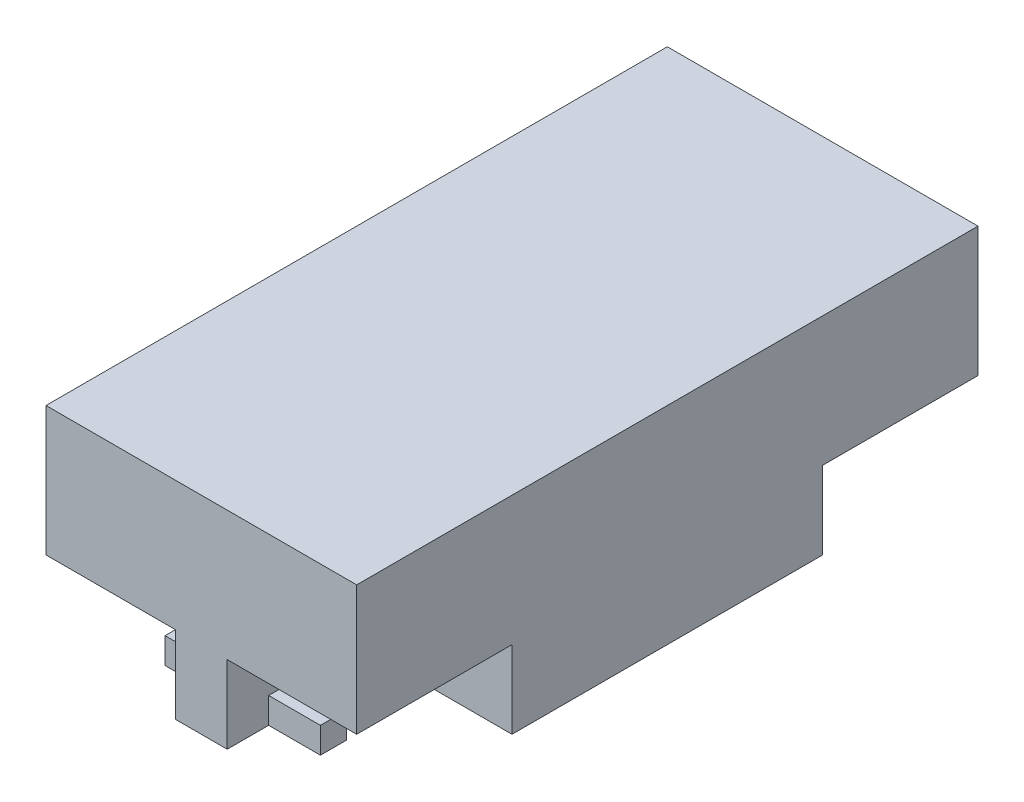
ISO-10303-21;
HEADER;
FILE_DESCRIPTION(('STEP AP214'),'2;1');
FILE_NAME('part.step','',(''),(''),'','','');
FILE_SCHEMA(('AUTOMOTIVE_DESIGN { 1 0 10303 214 1 1 1 1 }'));
ENDSEC;
DATA;
#1=APPLICATION_CONTEXT('core data for automotive mechanical design processes');
#2=APPLICATION_PROTOCOL_DEFINITION('international standard','automotive_design',2000,#1);
#3=PRODUCT_CONTEXT('',#1,'mechanical');
#4=PRODUCT('Part','Part','',(#3));
#5=PRODUCT_RELATED_PRODUCT_CATEGORY('part','',(#4));
#6=PRODUCT_DEFINITION_FORMATION('','',#4);
#7=PRODUCT_DEFINITION_CONTEXT('part definition',#1,'design');
#8=PRODUCT_DEFINITION('design','',#6,#7);
#9=PRODUCT_DEFINITION_SHAPE('','',#8);
#10=(LENGTH_UNIT() NAMED_UNIT(*) SI_UNIT(.MILLI.,.METRE.));
#11=(NAMED_UNIT(*) PLANE_ANGLE_UNIT() SI_UNIT($,.RADIAN.));
#12=(NAMED_UNIT(*) SI_UNIT($,.STERADIAN.) SOLID_ANGLE_UNIT());
#13=UNCERTAINTY_MEASURE_WITH_UNIT(LENGTH_MEASURE(1.E-05),#10,'distance_accuracy_value','');
#14=(GEOMETRIC_REPRESENTATION_CONTEXT(3) GLOBAL_UNCERTAINTY_ASSIGNED_CONTEXT((#13)) GLOBAL_UNIT_ASSIGNED_CONTEXT((#10,
#11,#12)) REPRESENTATION_CONTEXT('',''));
#15=CARTESIAN_POINT('',(0.,0.,0.));
#16=DIRECTION('',(0.,0.,1.));
#17=DIRECTION('',(1.,0.,0.));
#18=AXIS2_PLACEMENT_3D('',#15,#16,#17);
#19=CARTESIAN_POINT('',(-25.,0.,0.));
#20=DIRECTION('',(-1.,0.,0.));
#21=DIRECTION('',(0.,0.,-1.));
#22=AXIS2_PLACEMENT_3D('',#19,#20,#21);
#23=PLANE('',#22);
#24=DIRECTION('',(0.,0.,-1.));
#25=VECTOR('',#24,1.);
#26=CARTESIAN_POINT('',(-25.,-100.,-300.));
#27=LINE('',#26,#25);
#28=CARTESIAN_POINT('',(-25.,-100.,-260.));
#29=VERTEX_POINT('',#28);
#30=CARTESIAN_POINT('',(-25.,-100.,-300.));
#31=VERTEX_POINT('',#30);
#32=EDGE_CURVE('E401',#29,#31,#27,.T.);
#33=ORIENTED_EDGE('',*,*,#32,.F.);
#34=DIRECTION('',(0.,-1.,0.));
#35=VECTOR('',#34,1.);
#36=CARTESIAN_POINT('',(-25.,-75.,-260.));
#37=LINE('',#36,#35);
#38=CARTESIAN_POINT('',(-25.,-75.,-260.));
#39=VERTEX_POINT('',#38);
#40=EDGE_CURVE('E259',#39,#29,#37,.T.);
#41=ORIENTED_EDGE('',*,*,#40,.F.);
#42=DIRECTION('',(0.,0.,-1.));
#43=VECTOR('',#42,1.);
#44=CARTESIAN_POINT('',(-25.,-75.,-260.));
#45=LINE('',#44,#43);
#46=CARTESIAN_POINT('',(-25.,-75.,-235.));
#47=VERTEX_POINT('',#46);
#48=EDGE_CURVE('E290',#47,#39,#45,.T.);
#49=ORIENTED_EDGE('',*,*,#48,.F.);
#50=DIRECTION('',(0.,1.,0.));
#51=VECTOR('',#50,1.);
#52=CARTESIAN_POINT('',(-25.,-75.,-235.));
#53=LINE('',#52,#51);
#54=CARTESIAN_POINT('',(-25.,-100.,-235.));
#55=VERTEX_POINT('',#54);
#56=EDGE_CURVE('E299',#55,#47,#53,.T.);
#57=ORIENTED_EDGE('',*,*,#56,.F.);
#58=CARTESIAN_POINT('',(-25.,-100.,-150.));
#59=VERTEX_POINT('',#58);
#60=EDGE_CURVE('E403',#59,#55,#27,.T.);
#61=ORIENTED_EDGE('',*,*,#60,.F.);
#62=DIRECTION('',(0.,-1.,0.));
#63=VECTOR('',#62,1.);
#64=CARTESIAN_POINT('',(-25.,-100.,-150.));
#65=LINE('',#64,#63);
#66=CARTESIAN_POINT('',(-25.,-25.0000000000001,-150.));
#67=VERTEX_POINT('',#66);
#68=EDGE_CURVE('E406',#67,#59,#65,.T.);
#69=ORIENTED_EDGE('',*,*,#68,.F.);
#70=DIRECTION('',(0.,0.,1.));
#71=VECTOR('',#70,1.);
#72=CARTESIAN_POINT('',(-25.,-25.,-300.));
#73=LINE('',#72,#71);
#74=CARTESIAN_POINT('',(-25.,-25.,-300.));
#75=VERTEX_POINT('',#74);
#76=EDGE_CURVE('E408',#75,#67,#73,.T.);
#77=ORIENTED_EDGE('',*,*,#76,.F.);
#78=DIRECTION('',(0.,1.,0.));
#79=VECTOR('',#78,1.);
#80=CARTESIAN_POINT('',(-25.,-100.,-300.));
#81=LINE('',#80,#79);
#82=EDGE_CURVE('E398',#31,#75,#81,.T.);
#83=ORIENTED_EDGE('',*,*,#82,.F.);
#84=EDGE_LOOP('',(#33,#41,#49,#57,#61,#69,#77,#83));
#85=FACE_BOUND('',#84,.T.);
#86=ADVANCED_FACE('F39',(#85),#23,.T.);
#87=CARTESIAN_POINT('',(25.,0.,0.));
#88=DIRECTION('',(-1.,0.,0.));
#89=DIRECTION('',(0.,0.,1.));
#90=AXIS2_PLACEMENT_3D('',#87,#88,#89);
#91=PLANE('',#90);
#92=DIRECTION('',(0.,-1.,0.));
#93=VECTOR('',#92,1.);
#94=CARTESIAN_POINT('',(25.,-75.,260.));
#95=LINE('',#94,#93);
#96=CARTESIAN_POINT('',(25.,-75.,260.));
#97=VERTEX_POINT('',#96);
#98=CARTESIAN_POINT('',(25.,-100.,260.));
#99=VERTEX_POINT('',#98);
#100=EDGE_CURVE('E341',#97,#99,#95,.T.);
#101=ORIENTED_EDGE('',*,*,#100,.F.);
#102=DIRECTION('',(0.,0.,1.));
#103=VECTOR('',#102,1.);
#104=CARTESIAN_POINT('',(25.,-75.,260.));
#105=LINE('',#104,#103);
#106=CARTESIAN_POINT('',(25.,-75.,235.));
#107=VERTEX_POINT('',#106);
#108=EDGE_CURVE('E346',#107,#97,#105,.T.);
#109=ORIENTED_EDGE('',*,*,#108,.F.);
#110=DIRECTION('',(0.,1.,0.));
#111=VECTOR('',#110,1.);
#112=CARTESIAN_POINT('',(25.,-75.,235.));
#113=LINE('',#112,#111);
#114=CARTESIAN_POINT('',(25.,-100.,235.));
#115=VERTEX_POINT('',#114);
#116=EDGE_CURVE('E355',#115,#107,#113,.T.);
#117=ORIENTED_EDGE('',*,*,#116,.F.);
#118=DIRECTION('',(0.,0.,-1.));
#119=VECTOR('',#118,1.);
#120=CARTESIAN_POINT('',(25.,-100.,300.));
#121=LINE('',#120,#119);
#122=CARTESIAN_POINT('',(25.,-100.,150.));
#123=VERTEX_POINT('',#122);
#124=EDGE_CURVE('E423',#115,#123,#121,.T.);
#125=ORIENTED_EDGE('',*,*,#124,.T.);
#126=DIRECTION('',(0.,1.,0.));
#127=VECTOR('',#126,1.);
#128=CARTESIAN_POINT('',(25.,-100.,150.));
#129=LINE('',#128,#127);
#130=CARTESIAN_POINT('',(25.,-25.,150.));
#131=VERTEX_POINT('',#130);
#132=EDGE_CURVE('E427',#123,#131,#129,.T.);
#133=ORIENTED_EDGE('',*,*,#132,.T.);
#134=DIRECTION('',(0.,0.,1.));
#135=VECTOR('',#134,1.);
#136=CARTESIAN_POINT('',(25.,-25.,300.));
#137=LINE('',#136,#135);
#138=CARTESIAN_POINT('',(25.,-25.,300.));
#139=VERTEX_POINT('',#138);
#140=EDGE_CURVE('E430',#131,#139,#137,.T.);
#141=ORIENTED_EDGE('',*,*,#140,.T.);
#142=DIRECTION('',(0.,-1.,0.));
#143=VECTOR('',#142,1.);
#144=CARTESIAN_POINT('',(25.,-100.,300.));
#145=LINE('',#144,#143);
#146=CARTESIAN_POINT('',(25.,-100.,300.));
#147=VERTEX_POINT('',#146);
#148=EDGE_CURVE('E420',#139,#147,#145,.T.);
#149=ORIENTED_EDGE('',*,*,#148,.T.);
#150=EDGE_CURVE('E425',#147,#99,#121,.T.);
#151=ORIENTED_EDGE('',*,*,#150,.T.);
#152=EDGE_LOOP('',(#101,#109,#117,#125,#133,#141,#149,#151));
#153=FACE_BOUND('',#152,.T.);
#154=ADVANCED_FACE('F513',(#153),#91,.F.);
#155=CARTESIAN_POINT('',(-150.,100.,-300.));
#156=DIRECTION('',(0.,0.,-1.));
#157=DIRECTION('',(0.,1.,0.));
#158=AXIS2_PLACEMENT_3D('',#155,#156,#157);
#159=PLANE('',#158);
#160=ORIENTED_EDGE('',*,*,#82,.T.);
#161=DIRECTION('',(-1.,0.,0.));
#162=VECTOR('',#161,1.);
#163=CARTESIAN_POINT('',(-25.,-25.,-300.));
#164=LINE('',#163,#162);
#165=CARTESIAN_POINT('',(-150.,-25.,-300.));
#166=VERTEX_POINT('',#165);
#167=EDGE_CURVE('E388',#75,#166,#164,.T.);
#168=ORIENTED_EDGE('',*,*,#167,.T.);
#169=DIRECTION('',(0.,1.,0.));
#170=VECTOR('',#169,1.);
#171=CARTESIAN_POINT('',(-150.,100.,-300.));
#172=LINE('',#171,#170);
#173=CARTESIAN_POINT('',(-150.,100.,-300.));
#174=VERTEX_POINT('',#173);
#175=EDGE_CURVE('E478',#166,#174,#172,.T.);
#176=ORIENTED_EDGE('',*,*,#175,.T.);
#177=DIRECTION('',(1.,0.,0.));
#178=VECTOR('',#177,1.);
#179=CARTESIAN_POINT('',(-150.,100.,-300.));
#180=LINE('',#179,#178);
#181=CARTESIAN_POINT('',(150.,100.,-300.));
#182=VERTEX_POINT('',#181);
#183=EDGE_CURVE('E43',#174,#182,#180,.T.);
#184=ORIENTED_EDGE('',*,*,#183,.T.);
#185=DIRECTION('',(0.,1.,0.));
#186=VECTOR('',#185,1.);
#187=CARTESIAN_POINT('',(150.,100.,-300.));
#188=LINE('',#187,#186);
#189=CARTESIAN_POINT('',(150.,-25.,-300.));
#190=VERTEX_POINT('',#189);
#191=EDGE_CURVE('E442',#190,#182,#188,.T.);
#192=ORIENTED_EDGE('',*,*,#191,.F.);
#193=DIRECTION('',(1.,0.,0.));
#194=VECTOR('',#193,1.);
#195=CARTESIAN_POINT('',(25.,-25.,-300.));
#196=LINE('',#195,#194);
#197=CARTESIAN_POINT('',(25.,-25.,-300.));
#198=VERTEX_POINT('',#197);
#199=EDGE_CURVE('E459',#198,#190,#196,.T.);
#200=ORIENTED_EDGE('',*,*,#199,.F.);
#201=DIRECTION('',(0.,1.,0.));
#202=VECTOR('',#201,1.);
#203=CARTESIAN_POINT('',(25.,-100.,-300.));
#204=LINE('',#203,#202);
#205=CARTESIAN_POINT('',(25.,-100.,-300.));
#206=VERTEX_POINT('',#205);
#207=EDGE_CURVE('E446',#206,#198,#204,.T.);
#208=ORIENTED_EDGE('',*,*,#207,.F.);
#209=DIRECTION('',(1.,0.,0.));
#210=VECTOR('',#209,1.);
#211=CARTESIAN_POINT('',(-150.,-100.,-300.));
#212=LINE('',#211,#210);
#213=EDGE_CURVE('E11',#31,#206,#212,.T.);
#214=ORIENTED_EDGE('',*,*,#213,.F.);
#215=EDGE_LOOP('',(#160,#168,#176,#184,#192,#200,#208,#214));
#216=FACE_BOUND('',#215,.T.);
#217=ADVANCED_FACE('F41',(#216),#159,.T.);
#218=CARTESIAN_POINT('',(-150.,-100.,300.));
#219=DIRECTION('',(0.,-1.,0.));
#220=DIRECTION('',(0.,0.,-1.));
#221=AXIS2_PLACEMENT_3D('',#218,#219,#220);
#222=PLANE('',#221);
#223=DIRECTION('',(0.,0.,-1.));
#224=VECTOR('',#223,1.);
#225=CARTESIAN_POINT('',(-25.,-100.,300.));
#226=LINE('',#225,#224);
#227=CARTESIAN_POINT('',(-25.,-100.,300.));
#228=VERTEX_POINT('',#227);
#229=CARTESIAN_POINT('',(-25.,-100.,260.));
#230=VERTEX_POINT('',#229);
#231=EDGE_CURVE('E381',#228,#230,#226,.T.);
#232=ORIENTED_EDGE('',*,*,#231,.T.);
#233=DIRECTION('',(1.,0.,0.));
#234=VECTOR('',#233,1.);
#235=CARTESIAN_POINT('',(-75.,-100.,260.));
#236=LINE('',#235,#234);
#237=CARTESIAN_POINT('',(-75.,-100.,260.));
#238=VERTEX_POINT('',#237);
#239=EDGE_CURVE('E325',#238,#230,#236,.T.);
#240=ORIENTED_EDGE('',*,*,#239,.F.);
#241=DIRECTION('',(0.,0.,-1.));
#242=VECTOR('',#241,1.);
#243=CARTESIAN_POINT('',(-75.,-100.,260.));
#244=LINE('',#243,#242);
#245=CARTESIAN_POINT('',(-75.,-100.,235.));
#246=VERTEX_POINT('',#245);
#247=EDGE_CURVE('E322',#238,#246,#244,.T.);
#248=ORIENTED_EDGE('',*,*,#247,.T.);
#249=DIRECTION('',(1.,0.,0.));
#250=VECTOR('',#249,1.);
#251=CARTESIAN_POINT('',(-75.,-100.,235.));
#252=LINE('',#251,#250);
#253=CARTESIAN_POINT('',(-25.,-100.,235.));
#254=VERTEX_POINT('',#253);
#255=EDGE_CURVE('E334',#246,#254,#252,.T.);
#256=ORIENTED_EDGE('',*,*,#255,.T.);
#257=CARTESIAN_POINT('',(-25.,-100.,150.));
#258=VERTEX_POINT('',#257);
#259=EDGE_CURVE('E380',#254,#258,#226,.T.);
#260=ORIENTED_EDGE('',*,*,#259,.T.);
#261=DIRECTION('',(-1.,0.,0.));
#262=VECTOR('',#261,1.);
#263=CARTESIAN_POINT('',(-25.,-100.,150.));
#264=LINE('',#263,#262);
#265=CARTESIAN_POINT('',(-150.,-100.,150.));
#266=VERTEX_POINT('',#265);
#267=EDGE_CURVE('E391',#258,#266,#264,.T.);
#268=ORIENTED_EDGE('',*,*,#267,.T.);
#269=DIRECTION('',(0.,0.,-1.));
#270=VECTOR('',#269,1.);
#271=CARTESIAN_POINT('',(-150.,-100.,300.));
#272=LINE('',#271,#270);
#273=CARTESIAN_POINT('',(-150.,-100.,-150.));
#274=VERTEX_POINT('',#273);
#275=EDGE_CURVE('E486',#266,#274,#272,.T.);
#276=ORIENTED_EDGE('',*,*,#275,.T.);
#277=DIRECTION('',(-1.,0.,0.));
#278=VECTOR('',#277,1.);
#279=CARTESIAN_POINT('',(-25.,-100.,-150.));
#280=LINE('',#279,#278);
#281=EDGE_CURVE('E410',#59,#274,#280,.T.);
#282=ORIENTED_EDGE('',*,*,#281,.F.);
#283=ORIENTED_EDGE('',*,*,#60,.T.);
#284=DIRECTION('',(1.,0.,0.));
#285=VECTOR('',#284,1.);
#286=CARTESIAN_POINT('',(-75.,-100.,-235.));
#287=LINE('',#286,#285);
#288=CARTESIAN_POINT('',(-75.,-100.,-235.));
#289=VERTEX_POINT('',#288);
#290=EDGE_CURVE('E307',#289,#55,#287,.T.);
#291=ORIENTED_EDGE('',*,*,#290,.F.);
#292=DIRECTION('',(0.,0.,1.));
#293=VECTOR('',#292,1.);
#294=CARTESIAN_POINT('',(-75.,-100.,-260.));
#295=LINE('',#294,#293);
#296=CARTESIAN_POINT('',(-75.,-100.,-260.));
#297=VERTEX_POINT('',#296);
#298=EDGE_CURVE('E289',#297,#289,#295,.T.);
#299=ORIENTED_EDGE('',*,*,#298,.F.);
#300=DIRECTION('',(1.,0.,0.));
#301=VECTOR('',#300,1.);
#302=CARTESIAN_POINT('',(-75.,-100.,-260.));
#303=LINE('',#302,#301);
#304=EDGE_CURVE('E309',#297,#29,#303,.T.);
#305=ORIENTED_EDGE('',*,*,#304,.T.);
#306=ORIENTED_EDGE('',*,*,#32,.T.);
#307=ORIENTED_EDGE('',*,*,#213,.T.);
#308=DIRECTION('',(0.,0.,-1.));
#309=VECTOR('',#308,1.);
#310=CARTESIAN_POINT('',(25.,-100.,-300.));
#311=LINE('',#310,#309);
#312=CARTESIAN_POINT('',(25.,-100.,-260.));
#313=VERTEX_POINT('',#312);
#314=EDGE_CURVE('E456',#313,#206,#311,.T.);
#315=ORIENTED_EDGE('',*,*,#314,.F.);
#316=DIRECTION('',(-1.,0.,0.));
#317=VECTOR('',#316,1.);
#318=CARTESIAN_POINT('',(75.,-100.,-260.));
#319=LINE('',#318,#317);
#320=CARTESIAN_POINT('',(75.,-100.,-260.));
#321=VERTEX_POINT('',#320);
#322=EDGE_CURVE('E277',#321,#313,#319,.T.);
#323=ORIENTED_EDGE('',*,*,#322,.F.);
#324=DIRECTION('',(0.,0.,1.));
#325=VECTOR('',#324,1.);
#326=CARTESIAN_POINT('',(75.,-100.,-260.));
#327=LINE('',#326,#325);
#328=CARTESIAN_POINT('',(75.,-100.,-235.));
#329=VERTEX_POINT('',#328);
#330=EDGE_CURVE('E269',#321,#329,#327,.T.);
#331=ORIENTED_EDGE('',*,*,#330,.T.);
#332=DIRECTION('',(-1.,0.,0.));
#333=VECTOR('',#332,1.);
#334=CARTESIAN_POINT('',(75.,-100.,-235.));
#335=LINE('',#334,#333);
#336=CARTESIAN_POINT('',(25.,-100.,-235.));
#337=VERTEX_POINT('',#336);
#338=EDGE_CURVE('E282',#329,#337,#335,.T.);
#339=ORIENTED_EDGE('',*,*,#338,.T.);
#340=CARTESIAN_POINT('',(25.,-100.,-150.));
#341=VERTEX_POINT('',#340);
#342=EDGE_CURVE('E457',#341,#337,#311,.T.);
#343=ORIENTED_EDGE('',*,*,#342,.F.);
#344=DIRECTION('',(1.,0.,0.));
#345=VECTOR('',#344,1.);
#346=CARTESIAN_POINT('',(25.,-100.,-150.));
#347=LINE('',#346,#345);
#348=CARTESIAN_POINT('',(150.,-100.,-150.));
#349=VERTEX_POINT('',#348);
#350=EDGE_CURVE('E437',#341,#349,#347,.T.);
#351=ORIENTED_EDGE('',*,*,#350,.T.);
#352=DIRECTION('',(0.,0.,-1.));
#353=VECTOR('',#352,1.);
#354=CARTESIAN_POINT('',(150.,-100.,300.));
#355=LINE('',#354,#353);
#356=CARTESIAN_POINT('',(150.,-100.,150.));
#357=VERTEX_POINT('',#356);
#358=EDGE_CURVE('E475',#357,#349,#355,.T.);
#359=ORIENTED_EDGE('',*,*,#358,.F.);
#360=DIRECTION('',(1.,0.,0.));
#361=VECTOR('',#360,1.);
#362=CARTESIAN_POINT('',(25.,-100.,150.));
#363=LINE('',#362,#361);
#364=EDGE_CURVE('E433',#123,#357,#363,.T.);
#365=ORIENTED_EDGE('',*,*,#364,.F.);
#366=ORIENTED_EDGE('',*,*,#124,.F.);
#367=DIRECTION('',(-1.,0.,0.));
#368=VECTOR('',#367,1.);
#369=CARTESIAN_POINT('',(75.,-100.,235.));
#370=LINE('',#369,#368);
#371=CARTESIAN_POINT('',(75.,-100.,235.));
#372=VERTEX_POINT('',#371);
#373=EDGE_CURVE('E365',#372,#115,#370,.T.);
#374=ORIENTED_EDGE('',*,*,#373,.F.);
#375=DIRECTION('',(0.,0.,-1.));
#376=VECTOR('',#375,1.);
#377=CARTESIAN_POINT('',(75.,-100.,260.));
#378=LINE('',#377,#376);
#379=CARTESIAN_POINT('',(75.,-100.,260.));
#380=VERTEX_POINT('',#379);
#381=EDGE_CURVE('E345',#380,#372,#378,.T.);
#382=ORIENTED_EDGE('',*,*,#381,.F.);
#383=DIRECTION('',(-1.,0.,0.));
#384=VECTOR('',#383,1.);
#385=CARTESIAN_POINT('',(75.,-100.,260.));
#386=LINE('',#385,#384);
#387=EDGE_CURVE('E368',#380,#99,#386,.T.);
#388=ORIENTED_EDGE('',*,*,#387,.T.);
#389=ORIENTED_EDGE('',*,*,#150,.F.);
#390=DIRECTION('',(1.,0.,0.));
#391=VECTOR('',#390,1.);
#392=CARTESIAN_POINT('',(-150.,-100.,300.));
#393=LINE('',#392,#391);
#394=EDGE_CURVE('E48',#228,#147,#393,.T.);
#395=ORIENTED_EDGE('',*,*,#394,.F.);
#396=EDGE_LOOP('',(#232,#240,#248,#256,#260,#268,#276,#282,#283,#291,#299,#305,#306,#307,#315,
#323,#331,#339,#343,#351,#359,#365,#366,#374,#382,#388,#389,#395));
#397=FACE_BOUND('',#396,.T.);
#398=ADVANCED_FACE('F523',(#397),#222,.T.);
#399=CARTESIAN_POINT('',(-150.,100.,300.));
#400=DIRECTION('',(0.,0.,1.));
#401=DIRECTION('',(1.,0.,0.));
#402=AXIS2_PLACEMENT_3D('',#399,#400,#401);
#403=PLANE('',#402);
#404=DIRECTION('',(0.,-1.,0.));
#405=VECTOR('',#404,1.);
#406=CARTESIAN_POINT('',(-150.,100.,300.));
#407=LINE('',#406,#405);
#408=CARTESIAN_POINT('',(-150.,100.,300.));
#409=VERTEX_POINT('',#408);
#410=CARTESIAN_POINT('',(-150.,-25.,300.));
#411=VERTEX_POINT('',#410);
#412=EDGE_CURVE('E483',#409,#411,#407,.T.);
#413=ORIENTED_EDGE('',*,*,#412,.T.);
#414=DIRECTION('',(-1.,0.,0.));
#415=VECTOR('',#414,1.);
#416=CARTESIAN_POINT('',(-25.,-25.,300.));
#417=LINE('',#416,#415);
#418=CARTESIAN_POINT('',(-25.,-25.,300.));
#419=VERTEX_POINT('',#418);
#420=EDGE_CURVE('E384',#419,#411,#417,.T.);
#421=ORIENTED_EDGE('',*,*,#420,.F.);
#422=DIRECTION('',(0.,-1.,0.));
#423=VECTOR('',#422,1.);
#424=CARTESIAN_POINT('',(-25.,-100.,300.));
#425=LINE('',#424,#423);
#426=EDGE_CURVE('E372',#419,#228,#425,.T.);
#427=ORIENTED_EDGE('',*,*,#426,.T.);
#428=ORIENTED_EDGE('',*,*,#394,.T.);
#429=ORIENTED_EDGE('',*,*,#148,.F.);
#430=DIRECTION('',(1.,0.,0.));
#431=VECTOR('',#430,1.);
#432=CARTESIAN_POINT('',(25.,-25.,300.));
#433=LINE('',#432,#431);
#434=CARTESIAN_POINT('',(150.,-25.,300.));
#435=VERTEX_POINT('',#434);
#436=EDGE_CURVE('E439',#139,#435,#433,.T.);
#437=ORIENTED_EDGE('',*,*,#436,.T.);
#438=DIRECTION('',(0.,-1.,0.));
#439=VECTOR('',#438,1.);
#440=CARTESIAN_POINT('',(150.,100.,300.));
#441=LINE('',#440,#439);
#442=CARTESIAN_POINT('',(150.,100.,300.));
#443=VERTEX_POINT('',#442);
#444=EDGE_CURVE('E472',#443,#435,#441,.T.);
#445=ORIENTED_EDGE('',*,*,#444,.F.);
#446=DIRECTION('',(1.,0.,0.));
#447=VECTOR('',#446,1.);
#448=CARTESIAN_POINT('',(-150.,100.,300.));
#449=LINE('',#448,#447);
#450=EDGE_CURVE('E489',#409,#443,#449,.T.);
#451=ORIENTED_EDGE('',*,*,#450,.F.);
#452=EDGE_LOOP('',(#413,#421,#427,#428,#429,#437,#445,#451));
#453=FACE_BOUND('',#452,.T.);
#454=ADVANCED_FACE('F506',(#453),#403,.T.);
#455=CARTESIAN_POINT('',(-150.,0.,0.));
#456=DIRECTION('',(1.,0.,0.));
#457=DIRECTION('',(0.,0.,-1.));
#458=AXIS2_PLACEMENT_3D('',#455,#456,#457);
#459=PLANE('',#458);
#460=DIRECTION('',(0.,1.,0.));
#461=VECTOR('',#460,1.);
#462=CARTESIAN_POINT('',(-150.,-100.,150.));
#463=LINE('',#462,#461);
#464=CARTESIAN_POINT('',(-150.,-25.,150.));
#465=VERTEX_POINT('',#464);
#466=EDGE_CURVE('E376',#266,#465,#463,.T.);
#467=ORIENTED_EDGE('',*,*,#466,.T.);
#468=DIRECTION('',(0.,0.,1.));
#469=VECTOR('',#468,1.);
#470=CARTESIAN_POINT('',(-150.,-25.,300.));
#471=LINE('',#470,#469);
#472=EDGE_CURVE('E385',#465,#411,#471,.T.);
#473=ORIENTED_EDGE('',*,*,#472,.T.);
#474=ORIENTED_EDGE('',*,*,#412,.F.);
#475=DIRECTION('',(0.,0.,1.));
#476=VECTOR('',#475,1.);
#477=CARTESIAN_POINT('',(-150.,100.,300.));
#478=LINE('',#477,#476);
#479=EDGE_CURVE('E480',#174,#409,#478,.T.);
#480=ORIENTED_EDGE('',*,*,#479,.F.);
#481=ORIENTED_EDGE('',*,*,#175,.F.);
#482=DIRECTION('',(0.,0.,1.));
#483=VECTOR('',#482,1.);
#484=CARTESIAN_POINT('',(-150.,-25.,-300.));
#485=LINE('',#484,#483);
#486=CARTESIAN_POINT('',(-150.,-25.0000000000001,-150.));
#487=VERTEX_POINT('',#486);
#488=EDGE_CURVE('E402',#166,#487,#485,.T.);
#489=ORIENTED_EDGE('',*,*,#488,.T.);
#490=DIRECTION('',(0.,-1.,0.));
#491=VECTOR('',#490,1.);
#492=CARTESIAN_POINT('',(-150.,-100.,-150.));
#493=LINE('',#492,#491);
#494=EDGE_CURVE('E371',#487,#274,#493,.T.);
#495=ORIENTED_EDGE('',*,*,#494,.T.);
#496=ORIENTED_EDGE('',*,*,#275,.F.);
#497=EDGE_LOOP('',(#467,#473,#474,#480,#481,#489,#495,#496));
#498=FACE_BOUND('',#497,.T.);
#499=ADVANCED_FACE('F544',(#498),#459,.F.);
#500=CARTESIAN_POINT('',(-150.,100.,300.));
#501=DIRECTION('',(0.,1.,0.));
#502=DIRECTION('',(0.,0.,1.));
#503=AXIS2_PLACEMENT_3D('',#500,#501,#502);
#504=PLANE('',#503);
#505=ORIENTED_EDGE('',*,*,#450,.T.);
#506=DIRECTION('',(0.,0.,1.));
#507=VECTOR('',#506,1.);
#508=CARTESIAN_POINT('',(150.,100.,300.));
#509=LINE('',#508,#507);
#510=EDGE_CURVE('E469',#182,#443,#509,.T.);
#511=ORIENTED_EDGE('',*,*,#510,.F.);
#512=ORIENTED_EDGE('',*,*,#183,.F.);
#513=ORIENTED_EDGE('',*,*,#479,.T.);
#514=EDGE_LOOP('',(#505,#511,#512,#513));
#515=FACE_BOUND('',#514,.T.);
#516=ADVANCED_FACE('F499',(#515),#504,.T.);
#517=CARTESIAN_POINT('',(150.,0.,0.));
#518=DIRECTION('',(1.,0.,0.));
#519=DIRECTION('',(0.,0.,-1.));
#520=AXIS2_PLACEMENT_3D('',#517,#518,#519);
#521=PLANE('',#520);
#522=DIRECTION('',(0.,0.,1.));
#523=VECTOR('',#522,1.);
#524=CARTESIAN_POINT('',(150.,-25.,300.));
#525=LINE('',#524,#523);
#526=CARTESIAN_POINT('',(150.,-25.,150.));
#527=VERTEX_POINT('',#526);
#528=EDGE_CURVE('E424',#527,#435,#525,.T.);
#529=ORIENTED_EDGE('',*,*,#528,.F.);
#530=DIRECTION('',(0.,1.,0.));
#531=VECTOR('',#530,1.);
#532=CARTESIAN_POINT('',(150.,-100.,150.));
#533=LINE('',#532,#531);
#534=EDGE_CURVE('E434',#357,#527,#533,.T.);
#535=ORIENTED_EDGE('',*,*,#534,.F.);
#536=ORIENTED_EDGE('',*,*,#358,.T.);
#537=DIRECTION('',(0.,-1.,0.));
#538=VECTOR('',#537,1.);
#539=CARTESIAN_POINT('',(150.,-100.,-150.));
#540=LINE('',#539,#538);
#541=CARTESIAN_POINT('',(150.,-25.0000000000001,-150.));
#542=VERTEX_POINT('',#541);
#543=EDGE_CURVE('E450',#542,#349,#540,.T.);
#544=ORIENTED_EDGE('',*,*,#543,.F.);
#545=DIRECTION('',(0.,0.,1.));
#546=VECTOR('',#545,1.);
#547=CARTESIAN_POINT('',(150.,-25.,-300.));
#548=LINE('',#547,#546);
#549=EDGE_CURVE('E394',#190,#542,#548,.T.);
#550=ORIENTED_EDGE('',*,*,#549,.F.);
#551=ORIENTED_EDGE('',*,*,#191,.T.);
#552=ORIENTED_EDGE('',*,*,#510,.T.);
#553=ORIENTED_EDGE('',*,*,#444,.T.);
#554=EDGE_LOOP('',(#529,#535,#536,#544,#550,#551,#552,#553));
#555=FACE_BOUND('',#554,.T.);
#556=ADVANCED_FACE('F503',(#555),#521,.T.);
#557=CARTESIAN_POINT('',(25.,-100.,-150.));
#558=DIRECTION('',(0.,0.,1.));
#559=DIRECTION('',(1.,0.,0.));
#560=AXIS2_PLACEMENT_3D('',#557,#558,#559);
#561=PLANE('',#560);
#562=ORIENTED_EDGE('',*,*,#543,.T.);
#563=ORIENTED_EDGE('',*,*,#350,.F.);
#564=DIRECTION('',(0.,-1.,0.));
#565=VECTOR('',#564,1.);
#566=CARTESIAN_POINT('',(25.,-100.,-150.));
#567=LINE('',#566,#565);
#568=CARTESIAN_POINT('',(25.,-25.0000000000001,-150.));
#569=VERTEX_POINT('',#568);
#570=EDGE_CURVE('E453',#569,#341,#567,.T.);
#571=ORIENTED_EDGE('',*,*,#570,.F.);
#572=DIRECTION('',(1.,0.,0.));
#573=VECTOR('',#572,1.);
#574=CARTESIAN_POINT('',(25.,-25.0000000000001,-150.));
#575=LINE('',#574,#573);
#576=EDGE_CURVE('E465',#569,#542,#575,.T.);
#577=ORIENTED_EDGE('',*,*,#576,.T.);
#578=EDGE_LOOP('',(#562,#563,#571,#577));
#579=FACE_BOUND('',#578,.T.);
#580=ADVANCED_FACE('F528',(#579),#561,.F.);
#581=CARTESIAN_POINT('',(25.,-25.,-300.));
#582=DIRECTION('',(0.,1.,0.));
#583=DIRECTION('',(0.,0.,1.));
#584=AXIS2_PLACEMENT_3D('',#581,#582,#583);
#585=PLANE('',#584);
#586=ORIENTED_EDGE('',*,*,#549,.T.);
#587=ORIENTED_EDGE('',*,*,#576,.F.);
#588=DIRECTION('',(0.,0.,1.));
#589=VECTOR('',#588,1.);
#590=CARTESIAN_POINT('',(25.,-25.,-300.));
#591=LINE('',#590,#589);
#592=EDGE_CURVE('E449',#198,#569,#591,.T.);
#593=ORIENTED_EDGE('',*,*,#592,.F.);
#594=ORIENTED_EDGE('',*,*,#199,.T.);
#595=EDGE_LOOP('',(#586,#587,#593,#594));
#596=FACE_BOUND('',#595,.T.);
#597=ADVANCED_FACE('F531',(#596),#585,.F.);
#598=CARTESIAN_POINT('',(25.,0.,0.));
#599=DIRECTION('',(1.,0.,0.));
#600=DIRECTION('',(0.,0.,-1.));
#601=AXIS2_PLACEMENT_3D('',#598,#599,#600);
#602=PLANE('',#601);
#603=DIRECTION('',(0.,-1.,0.));
#604=VECTOR('',#603,1.);
#605=CARTESIAN_POINT('',(25.,-75.,-260.));
#606=LINE('',#605,#604);
#607=CARTESIAN_POINT('',(25.,-75.,-260.));
#608=VERTEX_POINT('',#607);
#609=EDGE_CURVE('E256',#608,#313,#606,.T.);
#610=ORIENTED_EDGE('',*,*,#609,.T.);
#611=ORIENTED_EDGE('',*,*,#314,.T.);
#612=ORIENTED_EDGE('',*,*,#207,.T.);
#613=ORIENTED_EDGE('',*,*,#592,.T.);
#614=ORIENTED_EDGE('',*,*,#570,.T.);
#615=ORIENTED_EDGE('',*,*,#342,.T.);
#616=DIRECTION('',(0.,1.,0.));
#617=VECTOR('',#616,1.);
#618=CARTESIAN_POINT('',(25.,-75.,-235.));
#619=LINE('',#618,#617);
#620=CARTESIAN_POINT('',(25.,-75.,-235.));
#621=VERTEX_POINT('',#620);
#622=EDGE_CURVE('E61',#337,#621,#619,.T.);
#623=ORIENTED_EDGE('',*,*,#622,.T.);
#624=DIRECTION('',(0.,0.,-1.));
#625=VECTOR('',#624,1.);
#626=CARTESIAN_POINT('',(25.,-75.,-260.));
#627=LINE('',#626,#625);
#628=EDGE_CURVE('E56',#621,#608,#627,.T.);
#629=ORIENTED_EDGE('',*,*,#628,.T.);
#630=EDGE_LOOP('',(#610,#611,#612,#613,#614,#615,#623,#629));
#631=FACE_BOUND('',#630,.T.);
#632=ADVANCED_FACE('F534',(#631),#602,.T.);
#633=CARTESIAN_POINT('',(25.,-25.,300.));
#634=DIRECTION('',(0.,1.,0.));
#635=DIRECTION('',(0.,0.,1.));
#636=AXIS2_PLACEMENT_3D('',#633,#634,#635);
#637=PLANE('',#636);
#638=ORIENTED_EDGE('',*,*,#528,.T.);
#639=ORIENTED_EDGE('',*,*,#436,.F.);
#640=ORIENTED_EDGE('',*,*,#140,.F.);
#641=DIRECTION('',(1.,0.,0.));
#642=VECTOR('',#641,1.);
#643=CARTESIAN_POINT('',(25.,-25.,150.));
#644=LINE('',#643,#642);
#645=EDGE_CURVE('E443',#131,#527,#644,.T.);
#646=ORIENTED_EDGE('',*,*,#645,.T.);
#647=EDGE_LOOP('',(#638,#639,#640,#646));
#648=FACE_BOUND('',#647,.T.);
#649=ADVANCED_FACE('F511',(#648),#637,.F.);
#650=CARTESIAN_POINT('',(25.,-100.,150.));
#651=DIRECTION('',(0.,0.,-1.));
#652=DIRECTION('',(-1.,0.,0.));
#653=AXIS2_PLACEMENT_3D('',#650,#651,#652);
#654=PLANE('',#653);
#655=ORIENTED_EDGE('',*,*,#534,.T.);
#656=ORIENTED_EDGE('',*,*,#645,.F.);
#657=ORIENTED_EDGE('',*,*,#132,.F.);
#658=ORIENTED_EDGE('',*,*,#364,.T.);
#659=EDGE_LOOP('',(#655,#656,#657,#658));
#660=FACE_BOUND('',#659,.T.);
#661=ADVANCED_FACE('F519',(#660),#654,.F.);
#662=CARTESIAN_POINT('',(-25.,-25.,-300.));
#663=DIRECTION('',(0.,-1.,0.));
#664=DIRECTION('',(0.,0.,-1.));
#665=AXIS2_PLACEMENT_3D('',#662,#663,#664);
#666=PLANE('',#665);
#667=ORIENTED_EDGE('',*,*,#488,.F.);
#668=ORIENTED_EDGE('',*,*,#167,.F.);
#669=ORIENTED_EDGE('',*,*,#76,.T.);
#670=DIRECTION('',(-1.,0.,0.));
#671=VECTOR('',#670,1.);
#672=CARTESIAN_POINT('',(-25.,-25.0000000000001,-150.));
#673=LINE('',#672,#671);
#674=EDGE_CURVE('E417',#67,#487,#673,.T.);
#675=ORIENTED_EDGE('',*,*,#674,.T.);
#676=EDGE_LOOP('',(#667,#668,#669,#675));
#677=FACE_BOUND('',#676,.T.);
#678=ADVANCED_FACE('F588',(#677),#666,.T.);
#679=CARTESIAN_POINT('',(-25.,-100.,-150.));
#680=DIRECTION('',(0.,0.,-1.));
#681=DIRECTION('',(-1.,0.,0.));
#682=AXIS2_PLACEMENT_3D('',#679,#680,#681);
#683=PLANE('',#682);
#684=ORIENTED_EDGE('',*,*,#494,.F.);
#685=ORIENTED_EDGE('',*,*,#674,.F.);
#686=ORIENTED_EDGE('',*,*,#68,.T.);
#687=ORIENTED_EDGE('',*,*,#281,.T.);
#688=EDGE_LOOP('',(#684,#685,#686,#687));
#689=FACE_BOUND('',#688,.T.);
#690=ADVANCED_FACE('F591',(#689),#683,.T.);
#691=CARTESIAN_POINT('',(-25.,-100.,150.));
#692=DIRECTION('',(0.,0.,1.));
#693=DIRECTION('',(1.,0.,0.));
#694=AXIS2_PLACEMENT_3D('',#691,#692,#693);
#695=PLANE('',#694);
#696=ORIENTED_EDGE('',*,*,#466,.F.);
#697=ORIENTED_EDGE('',*,*,#267,.F.);
#698=DIRECTION('',(0.,1.,0.));
#699=VECTOR('',#698,1.);
#700=CARTESIAN_POINT('',(-25.,-100.,150.));
#701=LINE('',#700,#699);
#702=CARTESIAN_POINT('',(-25.,-25.,150.));
#703=VERTEX_POINT('',#702);
#704=EDGE_CURVE('E378',#258,#703,#701,.T.);
#705=ORIENTED_EDGE('',*,*,#704,.T.);
#706=DIRECTION('',(-1.,0.,0.));
#707=VECTOR('',#706,1.);
#708=CARTESIAN_POINT('',(-25.,-25.,150.));
#709=LINE('',#708,#707);
#710=EDGE_CURVE('E395',#703,#465,#709,.T.);
#711=ORIENTED_EDGE('',*,*,#710,.T.);
#712=EDGE_LOOP('',(#696,#697,#705,#711));
#713=FACE_BOUND('',#712,.T.);
#714=ADVANCED_FACE('F593',(#713),#695,.T.);
#715=CARTESIAN_POINT('',(-25.,-25.,300.));
#716=DIRECTION('',(0.,-1.,0.));
#717=DIRECTION('',(0.,0.,-1.));
#718=AXIS2_PLACEMENT_3D('',#715,#716,#717);
#719=PLANE('',#718);
#720=ORIENTED_EDGE('',*,*,#472,.F.);
#721=ORIENTED_EDGE('',*,*,#710,.F.);
#722=DIRECTION('',(0.,0.,1.));
#723=VECTOR('',#722,1.);
#724=CARTESIAN_POINT('',(-25.,-25.,300.));
#725=LINE('',#724,#723);
#726=EDGE_CURVE('E375',#703,#419,#725,.T.);
#727=ORIENTED_EDGE('',*,*,#726,.T.);
#728=ORIENTED_EDGE('',*,*,#420,.T.);
#729=EDGE_LOOP('',(#720,#721,#727,#728));
#730=FACE_BOUND('',#729,.T.);
#731=ADVANCED_FACE('F550',(#730),#719,.T.);
#732=CARTESIAN_POINT('',(-25.,0.,0.));
#733=DIRECTION('',(1.,0.,0.));
#734=DIRECTION('',(0.,0.,1.));
#735=AXIS2_PLACEMENT_3D('',#732,#733,#734);
#736=PLANE('',#735);
#737=DIRECTION('',(0.,0.,1.));
#738=VECTOR('',#737,1.);
#739=CARTESIAN_POINT('',(-25.,-75.,260.));
#740=LINE('',#739,#738);
#741=CARTESIAN_POINT('',(-25.,-75.,235.));
#742=VERTEX_POINT('',#741);
#743=CARTESIAN_POINT('',(-25.,-75.,260.));
#744=VERTEX_POINT('',#743);
#745=EDGE_CURVE('E328',#742,#744,#740,.T.);
#746=ORIENTED_EDGE('',*,*,#745,.T.);
#747=DIRECTION('',(0.,-1.,0.));
#748=VECTOR('',#747,1.);
#749=CARTESIAN_POINT('',(-25.,-75.,260.));
#750=LINE('',#749,#748);
#751=EDGE_CURVE('E311',#744,#230,#750,.T.);
#752=ORIENTED_EDGE('',*,*,#751,.T.);
#753=ORIENTED_EDGE('',*,*,#231,.F.);
#754=ORIENTED_EDGE('',*,*,#426,.F.);
#755=ORIENTED_EDGE('',*,*,#726,.F.);
#756=ORIENTED_EDGE('',*,*,#704,.F.);
#757=ORIENTED_EDGE('',*,*,#259,.F.);
#758=DIRECTION('',(0.,1.,0.));
#759=VECTOR('',#758,1.);
#760=CARTESIAN_POINT('',(-25.,-75.,235.));
#761=LINE('',#760,#759);
#762=EDGE_CURVE('E316',#254,#742,#761,.T.);
#763=ORIENTED_EDGE('',*,*,#762,.T.);
#764=EDGE_LOOP('',(#746,#752,#753,#754,#755,#756,#757,#763));
#765=FACE_BOUND('',#764,.T.);
#766=ADVANCED_FACE('F555',(#765),#736,.F.);
#767=CARTESIAN_POINT('',(75.,-75.,260.));
#768=DIRECTION('',(0.,0.,-1.));
#769=DIRECTION('',(-1.,0.,0.));
#770=AXIS2_PLACEMENT_3D('',#767,#768,#769);
#771=PLANE('',#770);
#772=ORIENTED_EDGE('',*,*,#100,.T.);
#773=ORIENTED_EDGE('',*,*,#387,.F.);
#774=DIRECTION('',(0.,-1.,0.));
#775=VECTOR('',#774,1.);
#776=CARTESIAN_POINT('',(75.,-75.,260.));
#777=LINE('',#776,#775);
#778=CARTESIAN_POINT('',(75.,-75.,260.));
#779=VERTEX_POINT('',#778);
#780=EDGE_CURVE('E342',#779,#380,#777,.T.);
#781=ORIENTED_EDGE('',*,*,#780,.F.);
#782=DIRECTION('',(-1.,0.,0.));
#783=VECTOR('',#782,1.);
#784=CARTESIAN_POINT('',(75.,-75.,260.));
#785=LINE('',#784,#783);
#786=EDGE_CURVE('E352',#779,#97,#785,.T.);
#787=ORIENTED_EDGE('',*,*,#786,.T.);
#788=EDGE_LOOP('',(#772,#773,#781,#787));
#789=FACE_BOUND('',#788,.T.);
#790=ADVANCED_FACE('F565',(#789),#771,.F.);
#791=CARTESIAN_POINT('',(75.,-75.,235.));
#792=DIRECTION('',(0.,0.,1.));
#793=DIRECTION('',(1.,0.,0.));
#794=AXIS2_PLACEMENT_3D('',#791,#792,#793);
#795=PLANE('',#794);
#796=ORIENTED_EDGE('',*,*,#116,.T.);
#797=DIRECTION('',(-1.,0.,0.));
#798=VECTOR('',#797,1.);
#799=CARTESIAN_POINT('',(75.,-75.,235.));
#800=LINE('',#799,#798);
#801=CARTESIAN_POINT('',(75.,-75.,235.));
#802=VERTEX_POINT('',#801);
#803=EDGE_CURVE('E362',#802,#107,#800,.T.);
#804=ORIENTED_EDGE('',*,*,#803,.F.);
#805=DIRECTION('',(0.,1.,0.));
#806=VECTOR('',#805,1.);
#807=CARTESIAN_POINT('',(75.,-75.,235.));
#808=LINE('',#807,#806);
#809=EDGE_CURVE('E348',#372,#802,#808,.T.);
#810=ORIENTED_EDGE('',*,*,#809,.F.);
#811=ORIENTED_EDGE('',*,*,#373,.T.);
#812=EDGE_LOOP('',(#796,#804,#810,#811));
#813=FACE_BOUND('',#812,.T.);
#814=ADVANCED_FACE('F570',(#813),#795,.F.);
#815=CARTESIAN_POINT('',(75.,-75.,260.));
#816=DIRECTION('',(0.,-1.,0.));
#817=DIRECTION('',(0.,0.,-1.));
#818=AXIS2_PLACEMENT_3D('',#815,#816,#817);
#819=PLANE('',#818);
#820=ORIENTED_EDGE('',*,*,#108,.T.);
#821=ORIENTED_EDGE('',*,*,#786,.F.);
#822=DIRECTION('',(0.,0.,1.));
#823=VECTOR('',#822,1.);
#824=CARTESIAN_POINT('',(75.,-75.,260.));
#825=LINE('',#824,#823);
#826=EDGE_CURVE('E350',#802,#779,#825,.T.);
#827=ORIENTED_EDGE('',*,*,#826,.F.);
#828=ORIENTED_EDGE('',*,*,#803,.T.);
#829=EDGE_LOOP('',(#820,#821,#827,#828));
#830=FACE_BOUND('',#829,.T.);
#831=ADVANCED_FACE('F561',(#830),#819,.F.);
#832=CARTESIAN_POINT('',(75.,0.,0.));
#833=DIRECTION('',(1.,0.,0.));
#834=DIRECTION('',(0.,0.,-1.));
#835=AXIS2_PLACEMENT_3D('',#832,#833,#834);
#836=PLANE('',#835);
#837=ORIENTED_EDGE('',*,*,#780,.T.);
#838=ORIENTED_EDGE('',*,*,#381,.T.);
#839=ORIENTED_EDGE('',*,*,#809,.T.);
#840=ORIENTED_EDGE('',*,*,#826,.T.);
#841=EDGE_LOOP('',(#837,#838,#839,#840));
#842=FACE_BOUND('',#841,.T.);
#843=ADVANCED_FACE('F567',(#842),#836,.T.);
#844=CARTESIAN_POINT('',(-75.,-75.,260.));
#845=DIRECTION('',(0.,0.,1.));
#846=DIRECTION('',(1.,0.,0.));
#847=AXIS2_PLACEMENT_3D('',#844,#845,#846);
#848=PLANE('',#847);
#849=ORIENTED_EDGE('',*,*,#751,.F.);
#850=DIRECTION('',(1.,0.,0.));
#851=VECTOR('',#850,1.);
#852=CARTESIAN_POINT('',(-75.,-75.,260.));
#853=LINE('',#852,#851);
#854=CARTESIAN_POINT('',(-75.,-75.,260.));
#855=VERTEX_POINT('',#854);
#856=EDGE_CURVE('E339',#855,#744,#853,.T.);
#857=ORIENTED_EDGE('',*,*,#856,.F.);
#858=DIRECTION('',(0.,-1.,0.));
#859=VECTOR('',#858,1.);
#860=CARTESIAN_POINT('',(-75.,-75.,260.));
#861=LINE('',#860,#859);
#862=EDGE_CURVE('E312',#855,#238,#861,.T.);
#863=ORIENTED_EDGE('',*,*,#862,.T.);
#864=ORIENTED_EDGE('',*,*,#239,.T.);
#865=EDGE_LOOP('',(#849,#857,#863,#864));
#866=FACE_BOUND('',#865,.T.);
#867=ADVANCED_FACE('F697',(#866),#848,.T.);
#868=CARTESIAN_POINT('',(-75.,-75.,260.));
#869=DIRECTION('',(0.,1.,0.));
#870=DIRECTION('',(0.,0.,1.));
#871=AXIS2_PLACEMENT_3D('',#868,#869,#870);
#872=PLANE('',#871);
#873=ORIENTED_EDGE('',*,*,#745,.F.);
#874=DIRECTION('',(1.,0.,0.));
#875=VECTOR('',#874,1.);
#876=CARTESIAN_POINT('',(-75.,-75.,235.));
#877=LINE('',#876,#875);
#878=CARTESIAN_POINT('',(-75.,-75.,235.));
#879=VERTEX_POINT('',#878);
#880=EDGE_CURVE('E337',#879,#742,#877,.T.);
#881=ORIENTED_EDGE('',*,*,#880,.F.);
#882=DIRECTION('',(0.,0.,1.));
#883=VECTOR('',#882,1.);
#884=CARTESIAN_POINT('',(-75.,-75.,260.));
#885=LINE('',#884,#883);
#886=EDGE_CURVE('E315',#879,#855,#885,.T.);
#887=ORIENTED_EDGE('',*,*,#886,.T.);
#888=ORIENTED_EDGE('',*,*,#856,.T.);
#889=EDGE_LOOP('',(#873,#881,#887,#888));
#890=FACE_BOUND('',#889,.T.);
#891=ADVANCED_FACE('F706',(#890),#872,.T.);
#892=CARTESIAN_POINT('',(-75.,-75.,235.));
#893=DIRECTION('',(0.,0.,-1.));
#894=DIRECTION('',(-1.,0.,0.));
#895=AXIS2_PLACEMENT_3D('',#892,#893,#894);
#896=PLANE('',#895);
#897=ORIENTED_EDGE('',*,*,#762,.F.);
#898=ORIENTED_EDGE('',*,*,#255,.F.);
#899=DIRECTION('',(0.,1.,0.));
#900=VECTOR('',#899,1.);
#901=CARTESIAN_POINT('',(-75.,-75.,235.));
#902=LINE('',#901,#900);
#903=EDGE_CURVE('E319',#246,#879,#902,.T.);
#904=ORIENTED_EDGE('',*,*,#903,.T.);
#905=ORIENTED_EDGE('',*,*,#880,.T.);
#906=EDGE_LOOP('',(#897,#898,#904,#905));
#907=FACE_BOUND('',#906,.T.);
#908=ADVANCED_FACE('F714',(#907),#896,.T.);
#909=CARTESIAN_POINT('',(-75.,0.,0.));
#910=DIRECTION('',(-1.,0.,0.));
#911=DIRECTION('',(0.,0.,-1.));
#912=AXIS2_PLACEMENT_3D('',#909,#910,#911);
#913=PLANE('',#912);
#914=ORIENTED_EDGE('',*,*,#862,.F.);
#915=ORIENTED_EDGE('',*,*,#886,.F.);
#916=ORIENTED_EDGE('',*,*,#903,.F.);
#917=ORIENTED_EDGE('',*,*,#247,.F.);
#918=EDGE_LOOP('',(#914,#915,#916,#917));
#919=FACE_BOUND('',#918,.T.);
#920=ADVANCED_FACE('F722',(#919),#913,.T.);
#921=CARTESIAN_POINT('',(-75.,-75.,-260.));
#922=DIRECTION('',(0.,0.,1.));
#923=DIRECTION('',(1.,0.,0.));
#924=AXIS2_PLACEMENT_3D('',#921,#922,#923);
#925=PLANE('',#924);
#926=ORIENTED_EDGE('',*,*,#40,.T.);
#927=ORIENTED_EDGE('',*,*,#304,.F.);
#928=DIRECTION('',(0.,-1.,0.));
#929=VECTOR('',#928,1.);
#930=CARTESIAN_POINT('',(-75.,-75.,-260.));
#931=LINE('',#930,#929);
#932=CARTESIAN_POINT('',(-75.,-75.,-260.));
#933=VERTEX_POINT('',#932);
#934=EDGE_CURVE('E286',#933,#297,#931,.T.);
#935=ORIENTED_EDGE('',*,*,#934,.F.);
#936=DIRECTION('',(1.,0.,0.));
#937=VECTOR('',#936,1.);
#938=CARTESIAN_POINT('',(-75.,-75.,-260.));
#939=LINE('',#938,#937);
#940=EDGE_CURVE('E296',#933,#39,#939,.T.);
#941=ORIENTED_EDGE('',*,*,#940,.T.);
#942=EDGE_LOOP('',(#926,#927,#935,#941));
#943=FACE_BOUND('',#942,.T.);
#944=ADVANCED_FACE('F730',(#943),#925,.F.);
#945=CARTESIAN_POINT('',(-75.,-75.,-235.));
#946=DIRECTION('',(0.,0.,-1.));
#947=DIRECTION('',(-1.,0.,0.));
#948=AXIS2_PLACEMENT_3D('',#945,#946,#947);
#949=PLANE('',#948);
#950=ORIENTED_EDGE('',*,*,#56,.T.);
#951=DIRECTION('',(1.,0.,0.));
#952=VECTOR('',#951,1.);
#953=CARTESIAN_POINT('',(-75.,-75.,-235.));
#954=LINE('',#953,#952);
#955=CARTESIAN_POINT('',(-75.,-75.,-235.));
#956=VERTEX_POINT('',#955);
#957=EDGE_CURVE('E305',#956,#47,#954,.T.);
#958=ORIENTED_EDGE('',*,*,#957,.F.);
#959=DIRECTION('',(0.,1.,0.));
#960=VECTOR('',#959,1.);
#961=CARTESIAN_POINT('',(-75.,-75.,-235.));
#962=LINE('',#961,#960);
#963=EDGE_CURVE('E292',#289,#956,#962,.T.);
#964=ORIENTED_EDGE('',*,*,#963,.F.);
#965=ORIENTED_EDGE('',*,*,#290,.T.);
#966=EDGE_LOOP('',(#950,#958,#964,#965));
#967=FACE_BOUND('',#966,.T.);
#968=ADVANCED_FACE('F737',(#967),#949,.F.);
#969=CARTESIAN_POINT('',(-75.,-75.,-260.));
#970=DIRECTION('',(0.,-1.,0.));
#971=DIRECTION('',(0.,0.,-1.));
#972=AXIS2_PLACEMENT_3D('',#969,#970,#971);
#973=PLANE('',#972);
#974=ORIENTED_EDGE('',*,*,#48,.T.);
#975=ORIENTED_EDGE('',*,*,#940,.F.);
#976=DIRECTION('',(0.,0.,-1.));
#977=VECTOR('',#976,1.);
#978=CARTESIAN_POINT('',(-75.,-75.,-260.));
#979=LINE('',#978,#977);
#980=EDGE_CURVE('E294',#956,#933,#979,.T.);
#981=ORIENTED_EDGE('',*,*,#980,.F.);
#982=ORIENTED_EDGE('',*,*,#957,.T.);
#983=EDGE_LOOP('',(#974,#975,#981,#982));
#984=FACE_BOUND('',#983,.T.);
#985=ADVANCED_FACE('F745',(#984),#973,.F.);
#986=CARTESIAN_POINT('',(-75.,0.,0.));
#987=DIRECTION('',(-1.,0.,0.));
#988=DIRECTION('',(0.,0.,1.));
#989=AXIS2_PLACEMENT_3D('',#986,#987,#988);
#990=PLANE('',#989);
#991=ORIENTED_EDGE('',*,*,#934,.T.);
#992=ORIENTED_EDGE('',*,*,#298,.T.);
#993=ORIENTED_EDGE('',*,*,#963,.T.);
#994=ORIENTED_EDGE('',*,*,#980,.T.);
#995=EDGE_LOOP('',(#991,#992,#993,#994));
#996=FACE_BOUND('',#995,.T.);
#997=ADVANCED_FACE('F753',(#996),#990,.T.);
#998=CARTESIAN_POINT('',(75.,-75.,-260.));
#999=DIRECTION('',(0.,0.,-1.));
#1000=DIRECTION('',(-1.,0.,0.));
#1001=AXIS2_PLACEMENT_3D('',#998,#999,#1000);
#1002=PLANE('',#1001);
#1003=ORIENTED_EDGE('',*,*,#609,.F.);
#1004=DIRECTION('',(-1.,0.,0.));
#1005=VECTOR('',#1004,1.);
#1006=CARTESIAN_POINT('',(75.,-75.,-260.));
#1007=LINE('',#1006,#1005);
#1008=CARTESIAN_POINT('',(75.,-75.,-260.));
#1009=VERTEX_POINT('',#1008);
#1010=EDGE_CURVE('E250',#1009,#608,#1007,.T.);
#1011=ORIENTED_EDGE('',*,*,#1010,.F.);
#1012=DIRECTION('',(0.,-1.,0.));
#1013=VECTOR('',#1012,1.);
#1014=CARTESIAN_POINT('',(75.,-75.,-260.));
#1015=LINE('',#1014,#1013);
#1016=EDGE_CURVE('E254',#1009,#321,#1015,.T.);
#1017=ORIENTED_EDGE('',*,*,#1016,.T.);
#1018=ORIENTED_EDGE('',*,*,#322,.T.);
#1019=EDGE_LOOP('',(#1003,#1011,#1017,#1018));
#1020=FACE_BOUND('',#1019,.T.);
#1021=ADVANCED_FACE('F252',(#1020),#1002,.T.);
#1022=CARTESIAN_POINT('',(75.,-75.,-260.));
#1023=DIRECTION('',(0.,1.,0.));
#1024=DIRECTION('',(0.,0.,1.));
#1025=AXIS2_PLACEMENT_3D('',#1022,#1023,#1024);
#1026=PLANE('',#1025);
#1027=ORIENTED_EDGE('',*,*,#628,.F.);
#1028=DIRECTION('',(-1.,0.,0.));
#1029=VECTOR('',#1028,1.);
#1030=CARTESIAN_POINT('',(75.,-75.,-235.));
#1031=LINE('',#1030,#1029);
#1032=CARTESIAN_POINT('',(75.,-75.,-235.));
#1033=VERTEX_POINT('',#1032);
#1034=EDGE_CURVE('E260',#1033,#621,#1031,.T.);
#1035=ORIENTED_EDGE('',*,*,#1034,.F.);
#1036=DIRECTION('',(0.,0.,-1.));
#1037=VECTOR('',#1036,1.);
#1038=CARTESIAN_POINT('',(75.,-75.,-260.));
#1039=LINE('',#1038,#1037);
#1040=EDGE_CURVE('E266',#1033,#1009,#1039,.T.);
#1041=ORIENTED_EDGE('',*,*,#1040,.T.);
#1042=ORIENTED_EDGE('',*,*,#1010,.T.);
#1043=EDGE_LOOP('',(#1027,#1035,#1041,#1042));
#1044=FACE_BOUND('',#1043,.T.);
#1045=ADVANCED_FACE('F271',(#1044),#1026,.T.);
#1046=CARTESIAN_POINT('',(75.,-75.,-235.));
#1047=DIRECTION('',(0.,0.,1.));
#1048=DIRECTION('',(1.,0.,0.));
#1049=AXIS2_PLACEMENT_3D('',#1046,#1047,#1048);
#1050=PLANE('',#1049);
#1051=ORIENTED_EDGE('',*,*,#622,.F.);
#1052=ORIENTED_EDGE('',*,*,#338,.F.);
#1053=DIRECTION('',(0.,1.,0.));
#1054=VECTOR('',#1053,1.);
#1055=CARTESIAN_POINT('',(75.,-75.,-235.));
#1056=LINE('',#1055,#1054);
#1057=EDGE_CURVE('E272',#329,#1033,#1056,.T.);
#1058=ORIENTED_EDGE('',*,*,#1057,.T.);
#1059=ORIENTED_EDGE('',*,*,#1034,.T.);
#1060=EDGE_LOOP('',(#1051,#1052,#1058,#1059));
#1061=FACE_BOUND('',#1060,.T.);
#1062=ADVANCED_FACE('F774',(#1061),#1050,.T.);
#1063=CARTESIAN_POINT('',(75.,0.,0.));
#1064=DIRECTION('',(1.,0.,0.));
#1065=DIRECTION('',(0.,0.,1.));
#1066=AXIS2_PLACEMENT_3D('',#1063,#1064,#1065);
#1067=PLANE('',#1066);
#1068=ORIENTED_EDGE('',*,*,#1016,.F.);
#1069=ORIENTED_EDGE('',*,*,#1040,.F.);
#1070=ORIENTED_EDGE('',*,*,#1057,.F.);
#1071=ORIENTED_EDGE('',*,*,#330,.F.);
#1072=EDGE_LOOP('',(#1068,#1069,#1070,#1071));
#1073=FACE_BOUND('',#1072,.T.);
#1074=ADVANCED_FACE('F264',(#1073),#1067,.T.);
#1075=CLOSED_SHELL('',(#86,#154,#217,#398,#454,#499,#516,#556,#580,#597,#632,#649,#661,#678,
#690,#714,#731,#766,#790,#814,#831,#843,#867,#891,#908,#920,#944,#968,#985,#997,#1021,#1045,
#1062,#1074));
#1076=MANIFOLD_SOLID_BREP('B2',#1075);
#1077=ADVANCED_BREP_SHAPE_REPRESENTATION('',(#18,#1076),#14);
#1078=SHAPE_DEFINITION_REPRESENTATION(#9,#1077);
ENDSEC;
END-ISO-10303-21;
